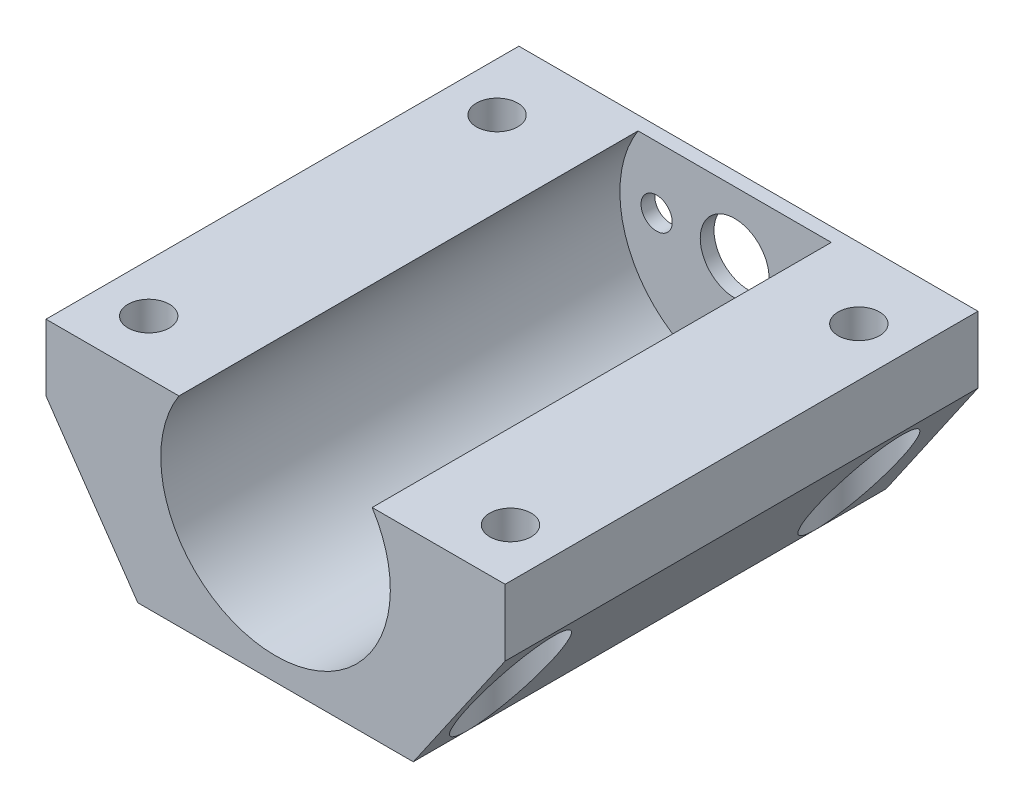
ISO-10303-21;
HEADER;
FILE_DESCRIPTION(('STEP AP214'),'2;1');
FILE_NAME('part.step','',(''),(''),'','','');
FILE_SCHEMA(('AUTOMOTIVE_DESIGN { 1 0 10303 214 1 1 1 1 }'));
ENDSEC;
DATA;
#1=APPLICATION_CONTEXT('core data for automotive mechanical design processes');
#2=APPLICATION_PROTOCOL_DEFINITION('international standard','automotive_design',2000,#1);
#3=PRODUCT_CONTEXT('',#1,'mechanical');
#4=PRODUCT('Part','Part','',(#3));
#5=PRODUCT_RELATED_PRODUCT_CATEGORY('part','',(#4));
#6=PRODUCT_DEFINITION_FORMATION('','',#4);
#7=PRODUCT_DEFINITION_CONTEXT('part definition',#1,'design');
#8=PRODUCT_DEFINITION('design','',#6,#7);
#9=PRODUCT_DEFINITION_SHAPE('','',#8);
#10=(LENGTH_UNIT() NAMED_UNIT(*) SI_UNIT(.MILLI.,.METRE.));
#11=(NAMED_UNIT(*) PLANE_ANGLE_UNIT() SI_UNIT($,.RADIAN.));
#12=(NAMED_UNIT(*) SI_UNIT($,.STERADIAN.) SOLID_ANGLE_UNIT());
#13=UNCERTAINTY_MEASURE_WITH_UNIT(LENGTH_MEASURE(1.E-05),#10,'distance_accuracy_value','');
#14=(GEOMETRIC_REPRESENTATION_CONTEXT(3) GLOBAL_UNCERTAINTY_ASSIGNED_CONTEXT((#13)) GLOBAL_UNIT_ASSIGNED_CONTEXT((#10,
#11,#12)) REPRESENTATION_CONTEXT('',''));
#15=CARTESIAN_POINT('',(0.,0.,0.));
#16=DIRECTION('',(0.,0.,1.));
#17=DIRECTION('',(1.,0.,0.));
#18=AXIS2_PLACEMENT_3D('',#15,#16,#17);
#19=CARTESIAN_POINT('',(0.,6.75,0.));
#20=DIRECTION('',(0.,1.,0.));
#21=DIRECTION('',(0.,0.,1.));
#22=AXIS2_PLACEMENT_3D('',#19,#20,#21);
#23=PLANE('',#22);
#24=CARTESIAN_POINT('',(19.6986749407734,6.75,44.1150104980837));
#25=DIRECTION('',(0.,1.,0.));
#26=DIRECTION('',(0.,0.,1.));
#27=AXIS2_PLACEMENT_3D('',#24,#25,#26);
#28=CIRCLE('',#27,2.25);
#29=CARTESIAN_POINT('',(19.6986749407734,6.75,46.3650104980837));
#30=VERTEX_POINT('',#29);
#31=EDGE_CURVE('E213',#30,#30,#28,.F.);
#32=ORIENTED_EDGE('',*,*,#31,.T.);
#33=EDGE_LOOP('',(#32));
#34=FACE_BOUND('',#33,.T.);
#35=CARTESIAN_POINT('',(-19.6986749407734,6.75,6.17682172326088));
#36=DIRECTION('',(0.,1.,0.));
#37=DIRECTION('',(0.,0.,1.));
#38=AXIS2_PLACEMENT_3D('',#35,#36,#37);
#39=CIRCLE('',#38,2.25);
#40=CARTESIAN_POINT('',(-19.6986749407734,6.75,8.42682172326087));
#41=VERTEX_POINT('',#40);
#42=EDGE_CURVE('E156',#41,#41,#39,.F.);
#43=ORIENTED_EDGE('',*,*,#42,.T.);
#44=EDGE_LOOP('',(#43));
#45=FACE_BOUND('',#44,.T.);
#46=DIRECTION('',(-1.,0.,0.));
#47=VECTOR('',#46,1.);
#48=CARTESIAN_POINT('',(0.,6.75,0.));
#49=LINE('',#48,#47);
#50=CARTESIAN_POINT('',(10.5208127062504,6.75,0.));
#51=VERTEX_POINT('',#50);
#52=CARTESIAN_POINT('',(-10.5208127062504,6.75,0.));
#53=VERTEX_POINT('',#52);
#54=EDGE_CURVE('E202',#51,#53,#49,.T.);
#55=ORIENTED_EDGE('',*,*,#54,.F.);
#56=DIRECTION('',(0.,0.,-1.));
#57=VECTOR('',#56,1.);
#58=CARTESIAN_POINT('',(10.5208127062504,6.75,50.));
#59=LINE('',#58,#57);
#60=CARTESIAN_POINT('',(10.5208127062504,6.75,50.));
#61=VERTEX_POINT('',#60);
#62=EDGE_CURVE('E145',#61,#51,#59,.T.);
#63=ORIENTED_EDGE('',*,*,#62,.F.);
#64=DIRECTION('',(-1.,0.,0.));
#65=VECTOR('',#64,1.);
#66=CARTESIAN_POINT('',(0.,6.75,50.));
#67=LINE('',#66,#65);
#68=CARTESIAN_POINT('',(25.,6.75,50.));
#69=VERTEX_POINT('',#68);
#70=EDGE_CURVE('E144',#69,#61,#67,.T.);
#71=ORIENTED_EDGE('',*,*,#70,.F.);
#72=DIRECTION('',(0.,0.,1.));
#73=VECTOR('',#72,1.);
#74=CARTESIAN_POINT('',(25.,6.75,50.));
#75=LINE('',#74,#73);
#76=CARTESIAN_POINT('',(25.,6.75,-1.5));
#77=VERTEX_POINT('',#76);
#78=EDGE_CURVE('E132',#77,#69,#75,.T.);
#79=ORIENTED_EDGE('',*,*,#78,.F.);
#80=DIRECTION('',(-1.,0.,0.));
#81=VECTOR('',#80,1.);
#82=CARTESIAN_POINT('',(0.,6.75,-1.5));
#83=LINE('',#82,#81);
#84=CARTESIAN_POINT('',(-25.,6.75,-1.5));
#85=VERTEX_POINT('',#84);
#86=EDGE_CURVE('E142',#77,#85,#83,.T.);
#87=ORIENTED_EDGE('',*,*,#86,.T.);
#88=DIRECTION('',(0.,0.,-1.));
#89=VECTOR('',#88,1.);
#90=CARTESIAN_POINT('',(-25.,6.75,50.));
#91=LINE('',#90,#89);
#92=CARTESIAN_POINT('',(-25.,6.75,50.));
#93=VERTEX_POINT('',#92);
#94=EDGE_CURVE('E146',#93,#85,#91,.T.);
#95=ORIENTED_EDGE('',*,*,#94,.F.);
#96=CARTESIAN_POINT('',(-10.5208127062504,6.75,50.));
#97=VERTEX_POINT('',#96);
#98=EDGE_CURVE('E205',#97,#93,#67,.T.);
#99=ORIENTED_EDGE('',*,*,#98,.F.);
#100=DIRECTION('',(0.,0.,-1.));
#101=VECTOR('',#100,1.);
#102=CARTESIAN_POINT('',(-10.5208127062504,6.75,50.));
#103=LINE('',#102,#101);
#104=EDGE_CURVE('E207',#53,#97,#103,.F.);
#105=ORIENTED_EDGE('',*,*,#104,.F.);
#106=EDGE_LOOP('',(#55,#63,#71,#79,#87,#95,#99,#105));
#107=FACE_BOUND('',#106,.T.);
#108=CARTESIAN_POINT('',(19.6986749407734,6.75,6.17682172326088));
#109=DIRECTION('',(0.,1.,0.));
#110=DIRECTION('',(0.,0.,1.));
#111=AXIS2_PLACEMENT_3D('',#108,#109,#110);
#112=CIRCLE('',#111,2.25);
#113=CARTESIAN_POINT('',(19.6986749407734,6.75,8.42682172326087));
#114=VERTEX_POINT('',#113);
#115=EDGE_CURVE('E153',#114,#114,#112,.F.);
#116=ORIENTED_EDGE('',*,*,#115,.T.);
#117=EDGE_LOOP('',(#116));
#118=FACE_BOUND('',#117,.T.);
#119=CARTESIAN_POINT('',(-19.6986749407734,6.75,44.1150104980837));
#120=DIRECTION('',(0.,1.,0.));
#121=DIRECTION('',(0.,0.,1.));
#122=AXIS2_PLACEMENT_3D('',#119,#120,#121);
#123=CIRCLE('',#122,2.25);
#124=CARTESIAN_POINT('',(-19.6986749407734,6.75,46.3650104980837));
#125=VERTEX_POINT('',#124);
#126=EDGE_CURVE('E216',#125,#125,#123,.F.);
#127=ORIENTED_EDGE('',*,*,#126,.T.);
#128=EDGE_LOOP('',(#127));
#129=FACE_BOUND('',#128,.T.);
#130=ADVANCED_FACE('F39',(#34,#45,#107,#118,#129),#23,.T.);
#131=CARTESIAN_POINT('',(-25.,0.,50.));
#132=DIRECTION('',(-1.,0.,0.));
#133=DIRECTION('',(0.,0.,1.));
#134=AXIS2_PLACEMENT_3D('',#131,#132,#133);
#135=PLANE('',#134);
#136=DIRECTION('',(0.,1.,0.));
#137=VECTOR('',#136,1.);
#138=CARTESIAN_POINT('',(-25.,0.,50.));
#139=LINE('',#138,#137);
#140=CARTESIAN_POINT('',(-25.,-0.500000000000001,50.));
#141=VERTEX_POINT('',#140);
#142=EDGE_CURVE('E166',#141,#93,#139,.T.);
#143=ORIENTED_EDGE('',*,*,#142,.T.);
#144=ORIENTED_EDGE('',*,*,#94,.T.);
#145=DIRECTION('',(0.,1.,0.));
#146=VECTOR('',#145,1.);
#147=CARTESIAN_POINT('',(-25.,14.,-1.5));
#148=LINE('',#147,#146);
#149=CARTESIAN_POINT('',(-25.,-0.500000000000001,-1.5));
#150=VERTEX_POINT('',#149);
#151=EDGE_CURVE('E151',#150,#85,#148,.T.);
#152=ORIENTED_EDGE('',*,*,#151,.F.);
#153=DIRECTION('',(0.,0.,-1.));
#154=VECTOR('',#153,1.);
#155=CARTESIAN_POINT('',(-25.,-0.500000000000001,50.));
#156=LINE('',#155,#154);
#157=EDGE_CURVE('E295',#141,#150,#156,.T.);
#158=ORIENTED_EDGE('',*,*,#157,.F.);
#159=EDGE_LOOP('',(#143,#144,#152,#158));
#160=FACE_BOUND('',#159,.T.);
#161=ADVANCED_FACE('F239',(#160),#135,.T.);
#162=CARTESIAN_POINT('',(25.,0.,50.));
#163=DIRECTION('',(1.,0.,0.));
#164=DIRECTION('',(0.,1.,0.));
#165=AXIS2_PLACEMENT_3D('',#162,#163,#164);
#166=PLANE('',#165);
#167=DIRECTION('',(0.,-1.,0.));
#168=VECTOR('',#167,1.);
#169=CARTESIAN_POINT('',(25.,-0.499999999999995,-1.5));
#170=LINE('',#169,#168);
#171=CARTESIAN_POINT('',(25.,-0.499999999999995,-1.5));
#172=VERTEX_POINT('',#171);
#173=EDGE_CURVE('E43',#77,#172,#170,.T.);
#174=ORIENTED_EDGE('',*,*,#173,.F.);
#175=ORIENTED_EDGE('',*,*,#78,.T.);
#176=DIRECTION('',(0.,-1.,0.));
#177=VECTOR('',#176,1.);
#178=CARTESIAN_POINT('',(25.,0.,50.));
#179=LINE('',#178,#177);
#180=CARTESIAN_POINT('',(25.,-0.499999999999995,50.));
#181=VERTEX_POINT('',#180);
#182=EDGE_CURVE('E163',#69,#181,#179,.T.);
#183=ORIENTED_EDGE('',*,*,#182,.T.);
#184=DIRECTION('',(0.,0.,-1.));
#185=VECTOR('',#184,1.);
#186=CARTESIAN_POINT('',(25.,-0.499999999999995,50.));
#187=LINE('',#186,#185);
#188=EDGE_CURVE('E135',#181,#172,#187,.T.);
#189=ORIENTED_EDGE('',*,*,#188,.T.);
#190=EDGE_LOOP('',(#174,#175,#183,#189));
#191=FACE_BOUND('',#190,.T.);
#192=ADVANCED_FACE('F131',(#191),#166,.T.);
#193=CARTESIAN_POINT('',(0.,0.,50.));
#194=DIRECTION('',(0.,0.,-1.));
#195=DIRECTION('',(-1.,0.,0.));
#196=AXIS2_PLACEMENT_3D('',#193,#194,#195);
#197=CYLINDRICAL_SURFACE('',#196,12.5);
#198=CARTESIAN_POINT('',(0.,0.,50.));
#199=DIRECTION('',(0.,0.,1.));
#200=DIRECTION('',(1.,0.,0.));
#201=AXIS2_PLACEMENT_3D('',#198,#199,#200);
#202=CIRCLE('',#201,12.5);
#203=EDGE_CURVE('E160',#97,#61,#202,.T.);
#204=ORIENTED_EDGE('',*,*,#203,.T.);
#205=ORIENTED_EDGE('',*,*,#62,.T.);
#206=CARTESIAN_POINT('',(0.,0.,0.));
#207=DIRECTION('',(0.,0.,1.));
#208=DIRECTION('',(1.,0.,0.));
#209=AXIS2_PLACEMENT_3D('',#206,#207,#208);
#210=CIRCLE('',#209,12.5);
#211=EDGE_CURVE('E169',#53,#51,#210,.T.);
#212=ORIENTED_EDGE('',*,*,#211,.F.);
#213=ORIENTED_EDGE('',*,*,#104,.T.);
#214=EDGE_LOOP('',(#204,#205,#212,#213));
#215=FACE_BOUND('',#214,.T.);
#216=ADVANCED_FACE('F247',(#215),#197,.F.);
#217=CARTESIAN_POINT('',(0.,0.,50.));
#218=DIRECTION('',(0.,0.,1.));
#219=DIRECTION('',(1.,0.,0.));
#220=AXIS2_PLACEMENT_3D('',#217,#218,#219);
#221=PLANE('',#220);
#222=ORIENTED_EDGE('',*,*,#182,.F.);
#223=ORIENTED_EDGE('',*,*,#70,.T.);
#224=ORIENTED_EDGE('',*,*,#203,.F.);
#225=ORIENTED_EDGE('',*,*,#98,.T.);
#226=ORIENTED_EDGE('',*,*,#142,.F.);
#227=DIRECTION('',(0.56773295580366,-0.823212785915306,0.));
#228=VECTOR('',#227,1.);
#229=CARTESIAN_POINT('',(-17.1756647864625,-11.8452860596293,50.));
#230=LINE('',#229,#228);
#231=CARTESIAN_POINT('',(-15.,-15.,50.));
#232=VERTEX_POINT('',#231);
#233=EDGE_CURVE('E170',#141,#232,#230,.T.);
#234=ORIENTED_EDGE('',*,*,#233,.T.);
#235=DIRECTION('',(-1.,0.,0.));
#236=VECTOR('',#235,1.);
#237=CARTESIAN_POINT('',(0.,-15.,50.));
#238=LINE('',#237,#236);
#239=CARTESIAN_POINT('',(15.,-15.,50.));
#240=VERTEX_POINT('',#239);
#241=EDGE_CURVE('E300',#240,#232,#238,.T.);
#242=ORIENTED_EDGE('',*,*,#241,.F.);
#243=DIRECTION('',(0.567732955803659,0.823212785915306,0.));
#244=VECTOR('',#243,1.);
#245=CARTESIAN_POINT('',(17.1756647864625,-11.8452860596293,50.));
#246=LINE('',#245,#244);
#247=EDGE_CURVE('E165',#240,#181,#246,.T.);
#248=ORIENTED_EDGE('',*,*,#247,.T.);
#249=EDGE_LOOP('',(#222,#223,#224,#225,#226,#234,#242,#248));
#250=FACE_BOUND('',#249,.T.);
#251=ADVANCED_FACE('F41',(#250),#221,.T.);
#252=CARTESIAN_POINT('',(19.6986749407734,-15.,44.1150104980837));
#253=DIRECTION('',(0.,-1.,0.));
#254=DIRECTION('',(0.,0.,-1.));
#255=AXIS2_PLACEMENT_3D('',#252,#253,#254);
#256=CYLINDRICAL_SURFACE('',#255,2.25);
#257=CARTESIAN_POINT('',(19.6986749407734,1.45,44.1150104980837));
#258=DIRECTION('',(0.,-1.,0.));
#259=DIRECTION('',(0.,0.,-1.));
#260=AXIS2_PLACEMENT_3D('',#257,#258,#259);
#261=CIRCLE('',#260,2.25);
#262=CARTESIAN_POINT('',(19.6986749407734,1.45,41.8650104980837));
#263=VERTEX_POINT('',#262);
#264=EDGE_CURVE('E172',#263,#263,#261,.T.);
#265=ORIENTED_EDGE('',*,*,#264,.T.);
#266=EDGE_LOOP('',(#265));
#267=FACE_BOUND('',#266,.T.);
#268=ORIENTED_EDGE('',*,*,#31,.F.);
#269=EDGE_LOOP('',(#268));
#270=FACE_BOUND('',#269,.T.);
#271=ADVANCED_FACE('F235',(#267,#270),#256,.F.);
#272=CARTESIAN_POINT('',(-19.6986749407734,-15.,44.1150104980837));
#273=DIRECTION('',(0.,-1.,0.));
#274=DIRECTION('',(0.,0.,-1.));
#275=AXIS2_PLACEMENT_3D('',#272,#273,#274);
#276=CYLINDRICAL_SURFACE('',#275,2.25);
#277=CARTESIAN_POINT('',(-19.6986749407734,1.44999999999999,44.1150104980837));
#278=DIRECTION('',(0.,-1.,0.));
#279=DIRECTION('',(0.,0.,-1.));
#280=AXIS2_PLACEMENT_3D('',#277,#278,#279);
#281=CIRCLE('',#280,2.25);
#282=CARTESIAN_POINT('',(-19.6986749407734,1.44999999999999,41.8650104980837));
#283=VERTEX_POINT('',#282);
#284=EDGE_CURVE('E329',#283,#283,#281,.T.);
#285=ORIENTED_EDGE('',*,*,#284,.T.);
#286=EDGE_LOOP('',(#285));
#287=FACE_BOUND('',#286,.T.);
#288=ORIENTED_EDGE('',*,*,#126,.F.);
#289=EDGE_LOOP('',(#288));
#290=FACE_BOUND('',#289,.T.);
#291=ADVANCED_FACE('F225',(#287,#290),#276,.F.);
#292=CARTESIAN_POINT('',(-19.6986749407734,-15.,6.17682172326088));
#293=DIRECTION('',(0.,-1.,0.));
#294=DIRECTION('',(0.,0.,-1.));
#295=AXIS2_PLACEMENT_3D('',#292,#293,#294);
#296=CYLINDRICAL_SURFACE('',#295,2.25);
#297=CARTESIAN_POINT('',(-19.6986749407734,1.44999999999999,6.17682172326088));
#298=DIRECTION('',(0.,-1.,0.));
#299=DIRECTION('',(0.,0.,-1.));
#300=AXIS2_PLACEMENT_3D('',#297,#298,#299);
#301=CIRCLE('',#300,2.25);
#302=CARTESIAN_POINT('',(-19.6986749407734,1.44999999999999,3.92682172326088));
#303=VERTEX_POINT('',#302);
#304=EDGE_CURVE('E340',#303,#303,#301,.T.);
#305=ORIENTED_EDGE('',*,*,#304,.T.);
#306=EDGE_LOOP('',(#305));
#307=FACE_BOUND('',#306,.T.);
#308=ORIENTED_EDGE('',*,*,#42,.F.);
#309=EDGE_LOOP('',(#308));
#310=FACE_BOUND('',#309,.T.);
#311=ADVANCED_FACE('F222',(#307,#310),#296,.F.);
#312=CARTESIAN_POINT('',(19.6986749407734,-15.,6.17682172326088));
#313=DIRECTION('',(0.,-1.,0.));
#314=DIRECTION('',(0.,0.,-1.));
#315=AXIS2_PLACEMENT_3D('',#312,#313,#314);
#316=CYLINDRICAL_SURFACE('',#315,2.25);
#317=CARTESIAN_POINT('',(19.6986749407734,1.45,6.17682172326088));
#318=DIRECTION('',(0.,-1.,0.));
#319=DIRECTION('',(0.,0.,-1.));
#320=AXIS2_PLACEMENT_3D('',#317,#318,#319);
#321=CIRCLE('',#320,2.25);
#322=CARTESIAN_POINT('',(19.6986749407734,1.45,3.92682172326088));
#323=VERTEX_POINT('',#322);
#324=EDGE_CURVE('E182',#323,#323,#321,.T.);
#325=ORIENTED_EDGE('',*,*,#324,.T.);
#326=EDGE_LOOP('',(#325));
#327=FACE_BOUND('',#326,.T.);
#328=ORIENTED_EDGE('',*,*,#115,.F.);
#329=EDGE_LOOP('',(#328));
#330=FACE_BOUND('',#329,.T.);
#331=ADVANCED_FACE('F224',(#327,#330),#316,.F.);
#332=CARTESIAN_POINT('',(0.,0.,0.));
#333=DIRECTION('',(0.,0.,1.));
#334=DIRECTION('',(1.,0.,0.));
#335=AXIS2_PLACEMENT_3D('',#332,#333,#334);
#336=PLANE('',#335);
#337=CARTESIAN_POINT('',(8.5,0.,0.));
#338=DIRECTION('',(0.,0.,1.));
#339=DIRECTION('',(1.,0.,0.));
#340=AXIS2_PLACEMENT_3D('',#337,#338,#339);
#341=CIRCLE('',#340,1.7);
#342=CARTESIAN_POINT('',(10.2,0.,0.));
#343=VERTEX_POINT('',#342);
#344=EDGE_CURVE('E48',#343,#343,#341,.T.);
#345=ORIENTED_EDGE('',*,*,#344,.F.);
#346=EDGE_LOOP('',(#345));
#347=FACE_BOUND('',#346,.T.);
#348=CARTESIAN_POINT('',(-8.5,0.,0.));
#349=DIRECTION('',(0.,0.,1.));
#350=DIRECTION('',(1.,0.,0.));
#351=AXIS2_PLACEMENT_3D('',#348,#349,#350);
#352=CIRCLE('',#351,1.7);
#353=CARTESIAN_POINT('',(-6.8,0.,0.));
#354=VERTEX_POINT('',#353);
#355=EDGE_CURVE('E192',#354,#354,#352,.T.);
#356=ORIENTED_EDGE('',*,*,#355,.F.);
#357=EDGE_LOOP('',(#356));
#358=FACE_BOUND('',#357,.T.);
#359=CARTESIAN_POINT('',(0.,0.,0.));
#360=DIRECTION('',(0.,0.,-1.));
#361=DIRECTION('',(-1.,0.,0.));
#362=AXIS2_PLACEMENT_3D('',#359,#360,#361);
#363=CIRCLE('',#362,3.75);
#364=CARTESIAN_POINT('',(-3.75,0.,0.));
#365=VERTEX_POINT('',#364);
#366=EDGE_CURVE('E189',#365,#365,#363,.T.);
#367=ORIENTED_EDGE('',*,*,#366,.T.);
#368=EDGE_LOOP('',(#367));
#369=FACE_BOUND('',#368,.T.);
#370=ORIENTED_EDGE('',*,*,#211,.T.);
#371=ORIENTED_EDGE('',*,*,#54,.T.);
#372=EDGE_LOOP('',(#370,#371));
#373=FACE_BOUND('',#372,.T.);
#374=ADVANCED_FACE('F232',(#347,#358,#369,#373),#336,.T.);
#375=CARTESIAN_POINT('',(0.,0.,-1.5));
#376=DIRECTION('',(0.,0.,1.));
#377=DIRECTION('',(1.,0.,0.));
#378=AXIS2_PLACEMENT_3D('',#375,#376,#377);
#379=PLANE('',#378);
#380=CARTESIAN_POINT('',(0.,0.,-1.5));
#381=DIRECTION('',(0.,0.,-1.));
#382=DIRECTION('',(-1.,0.,0.));
#383=AXIS2_PLACEMENT_3D('',#380,#381,#382);
#384=CIRCLE('',#383,3.75);
#385=CARTESIAN_POINT('',(-3.75,0.,-1.5));
#386=VERTEX_POINT('',#385);
#387=EDGE_CURVE('E136',#386,#386,#384,.T.);
#388=ORIENTED_EDGE('',*,*,#387,.F.);
#389=EDGE_LOOP('',(#388));
#390=FACE_BOUND('',#389,.T.);
#391=CARTESIAN_POINT('',(-8.5,0.,-1.5));
#392=DIRECTION('',(0.,0.,-1.));
#393=DIRECTION('',(-1.,0.,0.));
#394=AXIS2_PLACEMENT_3D('',#391,#392,#393);
#395=CIRCLE('',#394,1.7);
#396=CARTESIAN_POINT('',(-10.2,0.,-1.5));
#397=VERTEX_POINT('',#396);
#398=EDGE_CURVE('E197',#397,#397,#395,.T.);
#399=ORIENTED_EDGE('',*,*,#398,.F.);
#400=EDGE_LOOP('',(#399));
#401=FACE_BOUND('',#400,.T.);
#402=CARTESIAN_POINT('',(8.5,0.,-1.5));
#403=DIRECTION('',(0.,0.,-1.));
#404=DIRECTION('',(-1.,0.,0.));
#405=AXIS2_PLACEMENT_3D('',#402,#403,#404);
#406=CIRCLE('',#405,1.7);
#407=CARTESIAN_POINT('',(6.8,0.,-1.5));
#408=VERTEX_POINT('',#407);
#409=EDGE_CURVE('E11',#408,#408,#406,.T.);
#410=ORIENTED_EDGE('',*,*,#409,.F.);
#411=EDGE_LOOP('',(#410));
#412=FACE_BOUND('',#411,.T.);
#413=ORIENTED_EDGE('',*,*,#86,.F.);
#414=ORIENTED_EDGE('',*,*,#173,.T.);
#415=DIRECTION('',(-0.567732955803659,-0.823212785915306,0.));
#416=VECTOR('',#415,1.);
#417=CARTESIAN_POINT('',(15.,-15.,-1.5));
#418=LINE('',#417,#416);
#419=CARTESIAN_POINT('',(15.,-15.,-1.5));
#420=VERTEX_POINT('',#419);
#421=EDGE_CURVE('E137',#172,#420,#418,.T.);
#422=ORIENTED_EDGE('',*,*,#421,.T.);
#423=DIRECTION('',(-1.,0.,0.));
#424=VECTOR('',#423,1.);
#425=CARTESIAN_POINT('',(-15.,-15.,-1.5));
#426=LINE('',#425,#424);
#427=CARTESIAN_POINT('',(-15.,-15.,-1.5));
#428=VERTEX_POINT('',#427);
#429=EDGE_CURVE('E175',#420,#428,#426,.T.);
#430=ORIENTED_EDGE('',*,*,#429,.T.);
#431=DIRECTION('',(-0.56773295580366,0.823212785915306,0.));
#432=VECTOR('',#431,1.);
#433=CARTESIAN_POINT('',(-25.,-0.500000000000001,-1.5));
#434=LINE('',#433,#432);
#435=EDGE_CURVE('E173',#428,#150,#434,.T.);
#436=ORIENTED_EDGE('',*,*,#435,.T.);
#437=ORIENTED_EDGE('',*,*,#151,.T.);
#438=EDGE_LOOP('',(#413,#414,#422,#430,#436,#437));
#439=FACE_BOUND('',#438,.T.);
#440=ADVANCED_FACE('F148',(#390,#401,#412,#439),#379,.F.);
#441=CARTESIAN_POINT('',(-17.1756647864625,-11.8452860596293,50.));
#442=DIRECTION('',(0.823212785915306,0.56773295580366,0.));
#443=DIRECTION('',(-0.56773295580366,0.823212785915306,0.));
#444=AXIS2_PLACEMENT_3D('',#441,#442,#443);
#445=PLANE('',#444);
#446=DIRECTION('',(0.,0.,-1.));
#447=VECTOR('',#446,1.);
#448=CARTESIAN_POINT('',(-15.,-15.,50.));
#449=LINE('',#448,#447);
#450=CARTESIAN_POINT('',(-15.,-15.,6.06522512408244));
#451=VERTEX_POINT('',#450);
#452=EDGE_CURVE('E312',#451,#428,#449,.T.);
#453=ORIENTED_EDGE('',*,*,#452,.F.);
#454=CARTESIAN_POINT('',(-19.6986749407734,-8.18692133587859,6.17682172326088));
#455=DIRECTION('',(0.823212785915306,0.56773295580366,0.));
#456=DIRECTION('',(0.56773295580366,-0.823212785915306,0.));
#457=AXIS2_PLACEMENT_3D('',#454,#455,#456);
#458=ELLIPSE('',#457,8.27854002829001,4.7);
#459=CARTESIAN_POINT('',(-15.,-15.,6.28841832243932));
#460=VERTEX_POINT('',#459);
#461=EDGE_CURVE('E337',#451,#460,#458,.T.);
#462=ORIENTED_EDGE('',*,*,#461,.T.);
#463=CARTESIAN_POINT('',(-15.,-15.,44.0034138989053));
#464=VERTEX_POINT('',#463);
#465=EDGE_CURVE('E310',#464,#460,#449,.T.);
#466=ORIENTED_EDGE('',*,*,#465,.F.);
#467=CARTESIAN_POINT('',(-19.6986749407734,-8.18692133587859,44.1150104980837));
#468=DIRECTION('',(0.823212785915306,0.56773295580366,0.));
#469=DIRECTION('',(0.56773295580366,-0.823212785915306,0.));
#470=AXIS2_PLACEMENT_3D('',#467,#468,#469);
#471=ELLIPSE('',#470,8.27854002829001,4.7);
#472=CARTESIAN_POINT('',(-15.,-15.,44.2266070972622));
#473=VERTEX_POINT('',#472);
#474=EDGE_CURVE('E307',#464,#473,#471,.T.);
#475=ORIENTED_EDGE('',*,*,#474,.T.);
#476=EDGE_CURVE('E304',#232,#473,#449,.T.);
#477=ORIENTED_EDGE('',*,*,#476,.F.);
#478=ORIENTED_EDGE('',*,*,#233,.F.);
#479=ORIENTED_EDGE('',*,*,#157,.T.);
#480=ORIENTED_EDGE('',*,*,#435,.F.);
#481=EDGE_LOOP('',(#453,#462,#466,#475,#477,#478,#479,#480));
#482=FACE_BOUND('',#481,.T.);
#483=ADVANCED_FACE('F256',(#482),#445,.F.);
#484=CARTESIAN_POINT('',(0.,-15.,50.));
#485=DIRECTION('',(0.,-1.,0.));
#486=DIRECTION('',(1.,0.,0.));
#487=AXIS2_PLACEMENT_3D('',#484,#485,#486);
#488=PLANE('',#487);
#489=CARTESIAN_POINT('',(19.6986749407734,-15.,6.17682172326088));
#490=DIRECTION('',(0.,-1.,0.));
#491=DIRECTION('',(0.,0.,-1.));
#492=AXIS2_PLACEMENT_3D('',#489,#490,#491);
#493=CIRCLE('',#492,4.7);
#494=CARTESIAN_POINT('',(15.,-15.,6.28841832243896));
#495=VERTEX_POINT('',#494);
#496=CARTESIAN_POINT('',(15.,-15.,6.06522512408285));
#497=VERTEX_POINT('',#496);
#498=EDGE_CURVE('E174',#495,#497,#493,.T.);
#499=ORIENTED_EDGE('',*,*,#498,.F.);
#500=DIRECTION('',(0.,0.,-1.));
#501=VECTOR('',#500,1.);
#502=CARTESIAN_POINT('',(15.,-15.,50.));
#503=LINE('',#502,#501);
#504=CARTESIAN_POINT('',(15.,-15.,44.0034138989057));
#505=VERTEX_POINT('',#504);
#506=EDGE_CURVE('E587',#505,#495,#503,.T.);
#507=ORIENTED_EDGE('',*,*,#506,.F.);
#508=CARTESIAN_POINT('',(19.6986749407734,-15.,44.1150104980837));
#509=DIRECTION('',(0.,-1.,0.));
#510=DIRECTION('',(0.,0.,-1.));
#511=AXIS2_PLACEMENT_3D('',#508,#509,#510);
#512=CIRCLE('',#511,4.7);
#513=CARTESIAN_POINT('',(15.,-15.,44.2266070972618));
#514=VERTEX_POINT('',#513);
#515=EDGE_CURVE('E326',#514,#505,#512,.T.);
#516=ORIENTED_EDGE('',*,*,#515,.F.);
#517=EDGE_CURVE('E315',#240,#514,#503,.T.);
#518=ORIENTED_EDGE('',*,*,#517,.F.);
#519=ORIENTED_EDGE('',*,*,#241,.T.);
#520=ORIENTED_EDGE('',*,*,#476,.T.);
#521=CARTESIAN_POINT('',(-19.6986749407734,-15.,44.1150104980837));
#522=DIRECTION('',(0.,-1.,0.));
#523=DIRECTION('',(0.,0.,-1.));
#524=AXIS2_PLACEMENT_3D('',#521,#522,#523);
#525=CIRCLE('',#524,4.7);
#526=EDGE_CURVE('E335',#464,#473,#525,.T.);
#527=ORIENTED_EDGE('',*,*,#526,.F.);
#528=ORIENTED_EDGE('',*,*,#465,.T.);
#529=CARTESIAN_POINT('',(-19.6986749407734,-15.,6.17682172326088));
#530=DIRECTION('',(0.,-1.,0.));
#531=DIRECTION('',(0.,0.,-1.));
#532=AXIS2_PLACEMENT_3D('',#529,#530,#531);
#533=CIRCLE('',#532,4.7);
#534=EDGE_CURVE('E345',#451,#460,#533,.T.);
#535=ORIENTED_EDGE('',*,*,#534,.F.);
#536=ORIENTED_EDGE('',*,*,#452,.T.);
#537=ORIENTED_EDGE('',*,*,#429,.F.);
#538=EDGE_CURVE('E63',#497,#420,#503,.T.);
#539=ORIENTED_EDGE('',*,*,#538,.F.);
#540=EDGE_LOOP('',(#499,#507,#516,#518,#519,#520,#527,#528,#535,#536,#537,#539));
#541=FACE_BOUND('',#540,.T.);
#542=ADVANCED_FACE('F262',(#541),#488,.T.);
#543=CARTESIAN_POINT('',(17.1756647864625,-11.8452860596293,50.));
#544=DIRECTION('',(-0.823212785915307,0.567732955803659,0.));
#545=DIRECTION('',(-0.567732955803659,-0.823212785915307,0.));
#546=AXIS2_PLACEMENT_3D('',#543,#544,#545);
#547=PLANE('',#546);
#548=ORIENTED_EDGE('',*,*,#506,.T.);
#549=CARTESIAN_POINT('',(19.6986749407734,-8.18692133587857,6.17682172326088));
#550=DIRECTION('',(-0.823212785915307,0.567732955803659,0.));
#551=DIRECTION('',(-0.567732955803659,-0.823212785915307,0.));
#552=AXIS2_PLACEMENT_3D('',#549,#550,#551);
#553=ELLIPSE('',#552,8.27854002829001,4.7);
#554=EDGE_CURVE('E204',#495,#497,#553,.T.);
#555=ORIENTED_EDGE('',*,*,#554,.T.);
#556=ORIENTED_EDGE('',*,*,#538,.T.);
#557=ORIENTED_EDGE('',*,*,#421,.F.);
#558=ORIENTED_EDGE('',*,*,#188,.F.);
#559=ORIENTED_EDGE('',*,*,#247,.F.);
#560=ORIENTED_EDGE('',*,*,#517,.T.);
#561=CARTESIAN_POINT('',(19.6986749407734,-8.18692133587857,44.1150104980837));
#562=DIRECTION('',(-0.823212785915307,0.567732955803659,0.));
#563=DIRECTION('',(-0.567732955803659,-0.823212785915307,0.));
#564=AXIS2_PLACEMENT_3D('',#561,#562,#563);
#565=ELLIPSE('',#564,8.27854002829001,4.7);
#566=EDGE_CURVE('E588',#514,#505,#565,.T.);
#567=ORIENTED_EDGE('',*,*,#566,.T.);
#568=EDGE_LOOP('',(#548,#555,#556,#557,#558,#559,#560,#567));
#569=FACE_BOUND('',#568,.T.);
#570=ADVANCED_FACE('F452',(#569),#547,.F.);
#571=CARTESIAN_POINT('',(19.6986749407734,-15.,44.1150104980837));
#572=DIRECTION('',(0.,-1.,0.));
#573=DIRECTION('',(0.,0.,-1.));
#574=AXIS2_PLACEMENT_3D('',#571,#572,#573);
#575=CYLINDRICAL_SURFACE('',#574,4.7);
#576=CARTESIAN_POINT('',(19.6986749407734,-0.999999999999997,44.1150104980837));
#577=DIRECTION('',(0.,-1.,0.));
#578=DIRECTION('',(0.,0.,-1.));
#579=AXIS2_PLACEMENT_3D('',#576,#577,#578);
#580=CIRCLE('',#579,4.7);
#581=CARTESIAN_POINT('',(19.6986749407734,-0.999999999999997,39.4150104980837));
#582=VERTEX_POINT('',#581);
#583=EDGE_CURVE('E323',#582,#582,#580,.T.);
#584=ORIENTED_EDGE('',*,*,#583,.F.);
#585=EDGE_LOOP('',(#584));
#586=FACE_BOUND('',#585,.T.);
#587=ORIENTED_EDGE('',*,*,#515,.T.);
#588=ORIENTED_EDGE('',*,*,#566,.F.);
#589=EDGE_LOOP('',(#587,#588));
#590=FACE_BOUND('',#589,.T.);
#591=ADVANCED_FACE('F442',(#586,#590),#575,.F.);
#592=CARTESIAN_POINT('',(19.6986749407734,-0.999999999999997,44.1150104980837));
#593=DIRECTION('',(0.,-1.,0.));
#594=DIRECTION('',(0.,0.,-1.));
#595=AXIS2_PLACEMENT_3D('',#592,#593,#594);
#596=CONICAL_SURFACE('',#595,4.7,0.785398163397448);
#597=ORIENTED_EDGE('',*,*,#264,.F.);
#598=EDGE_LOOP('',(#597));
#599=FACE_BOUND('',#598,.T.);
#600=ORIENTED_EDGE('',*,*,#583,.T.);
#601=EDGE_LOOP('',(#600));
#602=FACE_BOUND('',#601,.T.);
#603=ADVANCED_FACE('F432',(#599,#602),#596,.F.);
#604=CARTESIAN_POINT('',(-19.6986749407734,-15.,44.1150104980837));
#605=DIRECTION('',(0.,-1.,0.));
#606=DIRECTION('',(0.,0.,-1.));
#607=AXIS2_PLACEMENT_3D('',#604,#605,#606);
#608=CYLINDRICAL_SURFACE('',#607,4.7);
#609=CARTESIAN_POINT('',(-19.6986749407734,-1.,44.1150104980837));
#610=DIRECTION('',(0.,-1.,0.));
#611=DIRECTION('',(0.,0.,-1.));
#612=AXIS2_PLACEMENT_3D('',#609,#610,#611);
#613=CIRCLE('',#612,4.7);
#614=CARTESIAN_POINT('',(-19.6986749407734,-1.,39.4150104980837));
#615=VERTEX_POINT('',#614);
#616=EDGE_CURVE('E332',#615,#615,#613,.T.);
#617=ORIENTED_EDGE('',*,*,#616,.F.);
#618=EDGE_LOOP('',(#617));
#619=FACE_BOUND('',#618,.T.);
#620=ORIENTED_EDGE('',*,*,#526,.T.);
#621=ORIENTED_EDGE('',*,*,#474,.F.);
#622=EDGE_LOOP('',(#620,#621));
#623=FACE_BOUND('',#622,.T.);
#624=ADVANCED_FACE('F422',(#619,#623),#608,.F.);
#625=CARTESIAN_POINT('',(-19.6986749407734,-1.,44.1150104980837));
#626=DIRECTION('',(0.,-1.,0.));
#627=DIRECTION('',(0.,0.,-1.));
#628=AXIS2_PLACEMENT_3D('',#625,#626,#627);
#629=CONICAL_SURFACE('',#628,4.7,0.785398163397448);
#630=ORIENTED_EDGE('',*,*,#284,.F.);
#631=EDGE_LOOP('',(#630));
#632=FACE_BOUND('',#631,.T.);
#633=ORIENTED_EDGE('',*,*,#616,.T.);
#634=EDGE_LOOP('',(#633));
#635=FACE_BOUND('',#634,.T.);
#636=ADVANCED_FACE('F413',(#632,#635),#629,.F.);
#637=CARTESIAN_POINT('',(-19.6986749407734,-15.,6.17682172326088));
#638=DIRECTION('',(0.,-1.,0.));
#639=DIRECTION('',(0.,0.,-1.));
#640=AXIS2_PLACEMENT_3D('',#637,#638,#639);
#641=CYLINDRICAL_SURFACE('',#640,4.7);
#642=CARTESIAN_POINT('',(-19.6986749407734,-1.,6.17682172326088));
#643=DIRECTION('',(0.,-1.,0.));
#644=DIRECTION('',(0.,0.,-1.));
#645=AXIS2_PLACEMENT_3D('',#642,#643,#644);
#646=CIRCLE('',#645,4.7);
#647=CARTESIAN_POINT('',(-19.6986749407734,-1.,1.47682172326088));
#648=VERTEX_POINT('',#647);
#649=EDGE_CURVE('E342',#648,#648,#646,.T.);
#650=ORIENTED_EDGE('',*,*,#649,.F.);
#651=EDGE_LOOP('',(#650));
#652=FACE_BOUND('',#651,.T.);
#653=ORIENTED_EDGE('',*,*,#534,.T.);
#654=ORIENTED_EDGE('',*,*,#461,.F.);
#655=EDGE_LOOP('',(#653,#654));
#656=FACE_BOUND('',#655,.T.);
#657=ADVANCED_FACE('F363',(#652,#656),#641,.F.);
#658=CARTESIAN_POINT('',(-19.6986749407734,-1.,6.17682172326088));
#659=DIRECTION('',(0.,-1.,0.));
#660=DIRECTION('',(0.,0.,-1.));
#661=AXIS2_PLACEMENT_3D('',#658,#659,#660);
#662=CONICAL_SURFACE('',#661,4.7,0.785398163397448);
#663=ORIENTED_EDGE('',*,*,#304,.F.);
#664=EDGE_LOOP('',(#663));
#665=FACE_BOUND('',#664,.T.);
#666=ORIENTED_EDGE('',*,*,#649,.T.);
#667=EDGE_LOOP('',(#666));
#668=FACE_BOUND('',#667,.T.);
#669=ADVANCED_FACE('F358',(#665,#668),#662,.F.);
#670=CARTESIAN_POINT('',(19.6986749407734,-15.,6.17682172326088));
#671=DIRECTION('',(0.,-1.,0.));
#672=DIRECTION('',(0.,0.,-1.));
#673=AXIS2_PLACEMENT_3D('',#670,#671,#672);
#674=CYLINDRICAL_SURFACE('',#673,4.7);
#675=CARTESIAN_POINT('',(19.6986749407734,-0.999999999999997,6.17682172326088));
#676=DIRECTION('',(0.,-1.,0.));
#677=DIRECTION('',(0.,0.,-1.));
#678=AXIS2_PLACEMENT_3D('',#675,#676,#677);
#679=CIRCLE('',#678,4.7);
#680=CARTESIAN_POINT('',(19.6986749407734,-0.999999999999997,1.47682172326088));
#681=VERTEX_POINT('',#680);
#682=EDGE_CURVE('E177',#681,#681,#679,.T.);
#683=ORIENTED_EDGE('',*,*,#682,.F.);
#684=EDGE_LOOP('',(#683));
#685=FACE_BOUND('',#684,.T.);
#686=ORIENTED_EDGE('',*,*,#498,.T.);
#687=ORIENTED_EDGE('',*,*,#554,.F.);
#688=EDGE_LOOP('',(#686,#687));
#689=FACE_BOUND('',#688,.T.);
#690=ADVANCED_FACE('F353',(#685,#689),#674,.F.);
#691=CARTESIAN_POINT('',(19.6986749407734,-0.999999999999997,6.17682172326088));
#692=DIRECTION('',(0.,-1.,0.));
#693=DIRECTION('',(0.,0.,-1.));
#694=AXIS2_PLACEMENT_3D('',#691,#692,#693);
#695=CONICAL_SURFACE('',#694,4.7,0.785398163397448);
#696=ORIENTED_EDGE('',*,*,#324,.F.);
#697=EDGE_LOOP('',(#696));
#698=FACE_BOUND('',#697,.T.);
#699=ORIENTED_EDGE('',*,*,#682,.T.);
#700=EDGE_LOOP('',(#699));
#701=FACE_BOUND('',#700,.T.);
#702=ADVANCED_FACE('F350',(#698,#701),#695,.F.);
#703=CARTESIAN_POINT('',(0.,0.,-1.5));
#704=DIRECTION('',(0.,0.,1.));
#705=DIRECTION('',(1.,0.,0.));
#706=AXIS2_PLACEMENT_3D('',#703,#704,#705);
#707=CYLINDRICAL_SURFACE('',#706,3.75);
#708=ORIENTED_EDGE('',*,*,#387,.T.);
#709=EDGE_LOOP('',(#708));
#710=FACE_BOUND('',#709,.T.);
#711=ORIENTED_EDGE('',*,*,#366,.F.);
#712=EDGE_LOOP('',(#711));
#713=FACE_BOUND('',#712,.T.);
#714=ADVANCED_FACE('F279',(#710,#713),#707,.F.);
#715=CARTESIAN_POINT('',(-8.5,0.,-1.5));
#716=DIRECTION('',(0.,0.,-1.));
#717=DIRECTION('',(-1.,0.,0.));
#718=AXIS2_PLACEMENT_3D('',#715,#716,#717);
#719=CYLINDRICAL_SURFACE('',#718,1.7);
#720=ORIENTED_EDGE('',*,*,#355,.T.);
#721=EDGE_LOOP('',(#720));
#722=FACE_BOUND('',#721,.T.);
#723=ORIENTED_EDGE('',*,*,#398,.T.);
#724=EDGE_LOOP('',(#723));
#725=FACE_BOUND('',#724,.T.);
#726=ADVANCED_FACE('F273',(#722,#725),#719,.F.);
#727=CARTESIAN_POINT('',(8.5,0.,-1.5));
#728=DIRECTION('',(0.,0.,-1.));
#729=DIRECTION('',(-1.,0.,0.));
#730=AXIS2_PLACEMENT_3D('',#727,#728,#729);
#731=CYLINDRICAL_SURFACE('',#730,1.7);
#732=ORIENTED_EDGE('',*,*,#344,.T.);
#733=EDGE_LOOP('',(#732));
#734=FACE_BOUND('',#733,.T.);
#735=ORIENTED_EDGE('',*,*,#409,.T.);
#736=EDGE_LOOP('',(#735));
#737=FACE_BOUND('',#736,.T.);
#738=ADVANCED_FACE('F251',(#734,#737),#731,.F.);
#739=CLOSED_SHELL('',(#130,#161,#192,#216,#251,#271,#291,#311,#331,#374,#440,#483,#542,#570,
#591,#603,#624,#636,#657,#669,#690,#702,#714,#726,#738));
#740=MANIFOLD_SOLID_BREP('B2',#739);
#741=ADVANCED_BREP_SHAPE_REPRESENTATION('',(#18,#740),#14);
#742=SHAPE_DEFINITION_REPRESENTATION(#9,#741);
ENDSEC;
END-ISO-10303-21;
